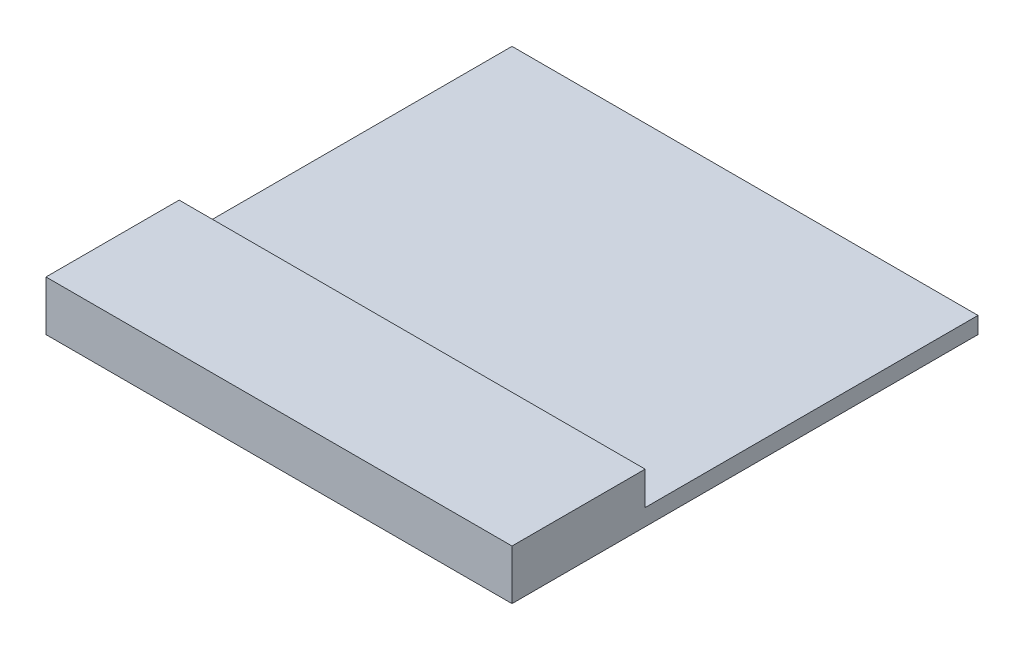
ISO-10303-21;
HEADER;
FILE_DESCRIPTION(('STEP AP214'),'2;1');
FILE_NAME('part.step','',(''),(''),'','','');
FILE_SCHEMA(('AUTOMOTIVE_DESIGN { 1 0 10303 214 1 1 1 1 }'));
ENDSEC;
DATA;
#1=APPLICATION_CONTEXT('core data for automotive mechanical design processes');
#2=APPLICATION_PROTOCOL_DEFINITION('international standard','automotive_design',2000,#1);
#3=PRODUCT_CONTEXT('',#1,'mechanical');
#4=PRODUCT('Part','Part','',(#3));
#5=PRODUCT_RELATED_PRODUCT_CATEGORY('part','',(#4));
#6=PRODUCT_DEFINITION_FORMATION('','',#4);
#7=PRODUCT_DEFINITION_CONTEXT('part definition',#1,'design');
#8=PRODUCT_DEFINITION('design','',#6,#7);
#9=PRODUCT_DEFINITION_SHAPE('','',#8);
#10=(LENGTH_UNIT() NAMED_UNIT(*) SI_UNIT(.MILLI.,.METRE.));
#11=(NAMED_UNIT(*) PLANE_ANGLE_UNIT() SI_UNIT($,.RADIAN.));
#12=(NAMED_UNIT(*) SI_UNIT($,.STERADIAN.) SOLID_ANGLE_UNIT());
#13=UNCERTAINTY_MEASURE_WITH_UNIT(LENGTH_MEASURE(1.E-05),#10,'distance_accuracy_value','');
#14=(GEOMETRIC_REPRESENTATION_CONTEXT(3) GLOBAL_UNCERTAINTY_ASSIGNED_CONTEXT((#13)) GLOBAL_UNIT_ASSIGNED_CONTEXT((#10,
#11,#12)) REPRESENTATION_CONTEXT('',''));
#15=CARTESIAN_POINT('',(0.,0.,0.));
#16=DIRECTION('',(0.,0.,1.));
#17=DIRECTION('',(1.,0.,0.));
#18=AXIS2_PLACEMENT_3D('',#15,#16,#17);
#19=CARTESIAN_POINT('',(0.,1.,0.));
#20=DIRECTION('',(0.,-1.,0.));
#21=DIRECTION('',(0.,0.,-1.));
#22=AXIS2_PLACEMENT_3D('',#19,#20,#21);
#23=PLANE('',#22);
#24=DIRECTION('',(-1.,0.,0.));
#25=VECTOR('',#24,1.);
#26=CARTESIAN_POINT('',(0.,1.,-8.));
#27=LINE('',#26,#25);
#28=CARTESIAN_POINT('',(28.,1.,-8.));
#29=VERTEX_POINT('',#28);
#30=CARTESIAN_POINT('',(0.,1.,-8.));
#31=VERTEX_POINT('',#30);
#32=EDGE_CURVE('E54',#29,#31,#27,.T.);
#33=ORIENTED_EDGE('',*,*,#32,.F.);
#34=DIRECTION('',(0.,0.,-1.));
#35=VECTOR('',#34,1.);
#36=CARTESIAN_POINT('',(28.,1.,0.));
#37=LINE('',#36,#35);
#38=CARTESIAN_POINT('',(28.,1.,-28.));
#39=VERTEX_POINT('',#38);
#40=EDGE_CURVE('E141',#29,#39,#37,.T.);
#41=ORIENTED_EDGE('',*,*,#40,.T.);
#42=DIRECTION('',(-1.,0.,0.));
#43=VECTOR('',#42,1.);
#44=CARTESIAN_POINT('',(0.,1.,-28.));
#45=LINE('',#44,#43);
#46=CARTESIAN_POINT('',(0.,1.,-28.));
#47=VERTEX_POINT('',#46);
#48=EDGE_CURVE('E60',#39,#47,#45,.T.);
#49=ORIENTED_EDGE('',*,*,#48,.T.);
#50=DIRECTION('',(0.,0.,1.));
#51=VECTOR('',#50,1.);
#52=CARTESIAN_POINT('',(0.,1.,0.));
#53=LINE('',#52,#51);
#54=EDGE_CURVE('E89',#47,#31,#53,.T.);
#55=ORIENTED_EDGE('',*,*,#54,.T.);
#56=EDGE_LOOP('',(#33,#41,#49,#55));
#57=FACE_BOUND('',#56,.T.);
#58=ADVANCED_FACE('F39',(#57),#23,.F.);
#59=CARTESIAN_POINT('',(0.,1.,0.));
#60=DIRECTION('',(1.,0.,0.));
#61=DIRECTION('',(0.,0.,-1.));
#62=AXIS2_PLACEMENT_3D('',#59,#60,#61);
#63=PLANE('',#62);
#64=DIRECTION('',(0.,0.,1.));
#65=VECTOR('',#64,1.);
#66=CARTESIAN_POINT('',(0.,0.,0.));
#67=LINE('',#66,#65);
#68=CARTESIAN_POINT('',(0.,0.,-28.));
#69=VERTEX_POINT('',#68);
#70=CARTESIAN_POINT('',(0.,0.,0.));
#71=VERTEX_POINT('',#70);
#72=EDGE_CURVE('E95',#69,#71,#67,.T.);
#73=ORIENTED_EDGE('',*,*,#72,.T.);
#74=DIRECTION('',(0.,-1.,0.));
#75=VECTOR('',#74,1.);
#76=CARTESIAN_POINT('',(0.,1.,0.));
#77=LINE('',#76,#75);
#78=CARTESIAN_POINT('',(0.,3.,0.));
#79=VERTEX_POINT('',#78);
#80=EDGE_CURVE('E11',#79,#71,#77,.T.);
#81=ORIENTED_EDGE('',*,*,#80,.F.);
#82=DIRECTION('',(0.,0.,1.));
#83=VECTOR('',#82,1.);
#84=CARTESIAN_POINT('',(0.,3.,0.));
#85=LINE('',#84,#83);
#86=CARTESIAN_POINT('',(0.,3.,-8.));
#87=VERTEX_POINT('',#86);
#88=EDGE_CURVE('E132',#87,#79,#85,.T.);
#89=ORIENTED_EDGE('',*,*,#88,.F.);
#90=DIRECTION('',(0.,-1.,0.));
#91=VECTOR('',#90,1.);
#92=CARTESIAN_POINT('',(0.,3.,-8.));
#93=LINE('',#92,#91);
#94=EDGE_CURVE('E104',#87,#31,#93,.T.);
#95=ORIENTED_EDGE('',*,*,#94,.T.);
#96=ORIENTED_EDGE('',*,*,#54,.F.);
#97=DIRECTION('',(0.,-1.,0.));
#98=VECTOR('',#97,1.);
#99=CARTESIAN_POINT('',(0.,1.,-28.));
#100=LINE('',#99,#98);
#101=EDGE_CURVE('E82',#47,#69,#100,.T.);
#102=ORIENTED_EDGE('',*,*,#101,.T.);
#103=EDGE_LOOP('',(#73,#81,#89,#95,#96,#102));
#104=FACE_BOUND('',#103,.T.);
#105=ADVANCED_FACE('F41',(#104),#63,.F.);
#106=CARTESIAN_POINT('',(0.,1.,0.));
#107=DIRECTION('',(0.,0.,-1.));
#108=DIRECTION('',(-1.,0.,0.));
#109=AXIS2_PLACEMENT_3D('',#106,#107,#108);
#110=PLANE('',#109);
#111=DIRECTION('',(1.,0.,0.));
#112=VECTOR('',#111,1.);
#113=CARTESIAN_POINT('',(0.,0.,0.));
#114=LINE('',#113,#112);
#115=CARTESIAN_POINT('',(28.,0.,0.));
#116=VERTEX_POINT('',#115);
#117=EDGE_CURVE('E99',#71,#116,#114,.T.);
#118=ORIENTED_EDGE('',*,*,#117,.T.);
#119=DIRECTION('',(0.,-1.,0.));
#120=VECTOR('',#119,1.);
#121=CARTESIAN_POINT('',(28.,1.,0.));
#122=LINE('',#121,#120);
#123=CARTESIAN_POINT('',(28.,3.,0.));
#124=VERTEX_POINT('',#123);
#125=EDGE_CURVE('E47',#124,#116,#122,.T.);
#126=ORIENTED_EDGE('',*,*,#125,.F.);
#127=DIRECTION('',(1.,0.,0.));
#128=VECTOR('',#127,1.);
#129=CARTESIAN_POINT('',(0.,3.,0.));
#130=LINE('',#129,#128);
#131=EDGE_CURVE('E124',#79,#124,#130,.T.);
#132=ORIENTED_EDGE('',*,*,#131,.F.);
#133=ORIENTED_EDGE('',*,*,#80,.T.);
#134=EDGE_LOOP('',(#118,#126,#132,#133));
#135=FACE_BOUND('',#134,.T.);
#136=ADVANCED_FACE('F122',(#135),#110,.F.);
#137=CARTESIAN_POINT('',(28.,1.,0.));
#138=DIRECTION('',(-1.,0.,0.));
#139=DIRECTION('',(0.,0.,1.));
#140=AXIS2_PLACEMENT_3D('',#137,#138,#139);
#141=PLANE('',#140);
#142=DIRECTION('',(0.,0.,-1.));
#143=VECTOR('',#142,1.);
#144=CARTESIAN_POINT('',(28.,0.,0.));
#145=LINE('',#144,#143);
#146=CARTESIAN_POINT('',(28.,0.,-28.));
#147=VERTEX_POINT('',#146);
#148=EDGE_CURVE('E90',#116,#147,#145,.T.);
#149=ORIENTED_EDGE('',*,*,#148,.T.);
#150=DIRECTION('',(0.,-1.,0.));
#151=VECTOR('',#150,1.);
#152=CARTESIAN_POINT('',(28.,1.,-28.));
#153=LINE('',#152,#151);
#154=EDGE_CURVE('E85',#39,#147,#153,.T.);
#155=ORIENTED_EDGE('',*,*,#154,.F.);
#156=ORIENTED_EDGE('',*,*,#40,.F.);
#157=DIRECTION('',(0.,-1.,0.));
#158=VECTOR('',#157,1.);
#159=CARTESIAN_POINT('',(28.,3.,-8.));
#160=LINE('',#159,#158);
#161=CARTESIAN_POINT('',(28.,3.,-8.));
#162=VERTEX_POINT('',#161);
#163=EDGE_CURVE('E100',#162,#29,#160,.T.);
#164=ORIENTED_EDGE('',*,*,#163,.F.);
#165=DIRECTION('',(0.,0.,-1.));
#166=VECTOR('',#165,1.);
#167=CARTESIAN_POINT('',(28.,3.,0.));
#168=LINE('',#167,#166);
#169=EDGE_CURVE('E118',#124,#162,#168,.T.);
#170=ORIENTED_EDGE('',*,*,#169,.F.);
#171=ORIENTED_EDGE('',*,*,#125,.T.);
#172=EDGE_LOOP('',(#149,#155,#156,#164,#170,#171));
#173=FACE_BOUND('',#172,.T.);
#174=ADVANCED_FACE('F114',(#173),#141,.F.);
#175=CARTESIAN_POINT('',(0.,1.,-28.));
#176=DIRECTION('',(0.,0.,1.));
#177=DIRECTION('',(1.,0.,0.));
#178=AXIS2_PLACEMENT_3D('',#175,#176,#177);
#179=PLANE('',#178);
#180=DIRECTION('',(-1.,0.,0.));
#181=VECTOR('',#180,1.);
#182=CARTESIAN_POINT('',(0.,0.,-28.));
#183=LINE('',#182,#181);
#184=EDGE_CURVE('E79',#147,#69,#183,.T.);
#185=ORIENTED_EDGE('',*,*,#184,.T.);
#186=ORIENTED_EDGE('',*,*,#101,.F.);
#187=ORIENTED_EDGE('',*,*,#48,.F.);
#188=ORIENTED_EDGE('',*,*,#154,.T.);
#189=EDGE_LOOP('',(#185,#186,#187,#188));
#190=FACE_BOUND('',#189,.T.);
#191=ADVANCED_FACE('F81',(#190),#179,.F.);
#192=CARTESIAN_POINT('',(0.,0.,0.));
#193=DIRECTION('',(0.,-1.,0.));
#194=DIRECTION('',(0.,0.,-1.));
#195=AXIS2_PLACEMENT_3D('',#192,#193,#194);
#196=PLANE('',#195);
#197=ORIENTED_EDGE('',*,*,#72,.F.);
#198=ORIENTED_EDGE('',*,*,#184,.F.);
#199=ORIENTED_EDGE('',*,*,#148,.F.);
#200=ORIENTED_EDGE('',*,*,#117,.F.);
#201=EDGE_LOOP('',(#197,#198,#199,#200));
#202=FACE_BOUND('',#201,.T.);
#203=ADVANCED_FACE('F98',(#202),#196,.T.);
#204=CARTESIAN_POINT('',(0.,3.,-8.));
#205=DIRECTION('',(0.,0.,1.));
#206=DIRECTION('',(1.,0.,0.));
#207=AXIS2_PLACEMENT_3D('',#204,#205,#206);
#208=PLANE('',#207);
#209=ORIENTED_EDGE('',*,*,#32,.T.);
#210=ORIENTED_EDGE('',*,*,#94,.F.);
#211=DIRECTION('',(-1.,0.,0.));
#212=VECTOR('',#211,1.);
#213=CARTESIAN_POINT('',(0.,3.,-8.));
#214=LINE('',#213,#212);
#215=EDGE_CURVE('E134',#162,#87,#214,.T.);
#216=ORIENTED_EDGE('',*,*,#215,.F.);
#217=ORIENTED_EDGE('',*,*,#163,.T.);
#218=EDGE_LOOP('',(#209,#210,#216,#217));
#219=FACE_BOUND('',#218,.T.);
#220=ADVANCED_FACE('F144',(#219),#208,.F.);
#221=CARTESIAN_POINT('',(0.,3.,0.));
#222=DIRECTION('',(0.,-1.,0.));
#223=DIRECTION('',(0.,0.,-1.));
#224=AXIS2_PLACEMENT_3D('',#221,#222,#223);
#225=PLANE('',#224);
#226=ORIENTED_EDGE('',*,*,#88,.T.);
#227=ORIENTED_EDGE('',*,*,#131,.T.);
#228=ORIENTED_EDGE('',*,*,#169,.T.);
#229=ORIENTED_EDGE('',*,*,#215,.T.);
#230=EDGE_LOOP('',(#226,#227,#228,#229));
#231=FACE_BOUND('',#230,.T.);
#232=ADVANCED_FACE('F129',(#231),#225,.F.);
#233=CLOSED_SHELL('',(#58,#105,#136,#174,#191,#203,#220,#232));
#234=MANIFOLD_SOLID_BREP('B2',#233);
#235=ADVANCED_BREP_SHAPE_REPRESENTATION('',(#18,#234),#14);
#236=SHAPE_DEFINITION_REPRESENTATION(#9,#235);
ENDSEC;
END-ISO-10303-21;
